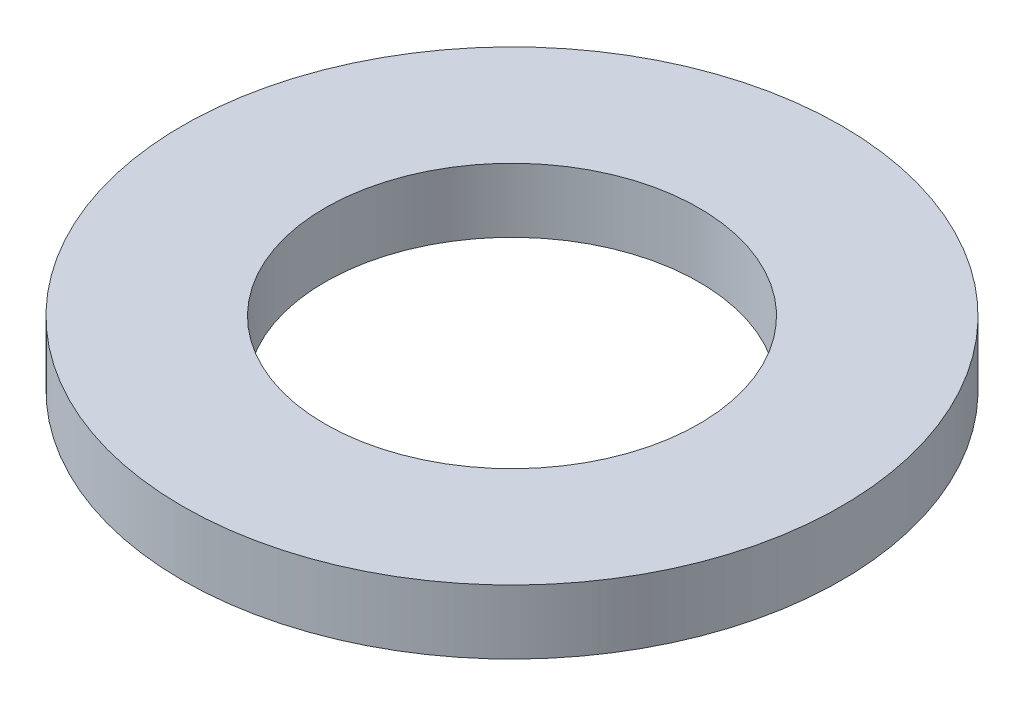
ISO-10303-21;
HEADER;
FILE_DESCRIPTION(('STEP AP214'),'2;1');
FILE_NAME('part.step','',(''),(''),'','','');
FILE_SCHEMA(('AUTOMOTIVE_DESIGN { 1 0 10303 214 1 1 1 1 }'));
ENDSEC;
DATA;
#1=APPLICATION_CONTEXT('core data for automotive mechanical design processes');
#2=APPLICATION_PROTOCOL_DEFINITION('international standard','automotive_design',2000,#1);
#3=PRODUCT_CONTEXT('',#1,'mechanical');
#4=PRODUCT('Part','Part','',(#3));
#5=PRODUCT_RELATED_PRODUCT_CATEGORY('part','',(#4));
#6=PRODUCT_DEFINITION_FORMATION('','',#4);
#7=PRODUCT_DEFINITION_CONTEXT('part definition',#1,'design');
#8=PRODUCT_DEFINITION('design','',#6,#7);
#9=PRODUCT_DEFINITION_SHAPE('','',#8);
#10=(LENGTH_UNIT() NAMED_UNIT(*) SI_UNIT(.MILLI.,.METRE.));
#11=(NAMED_UNIT(*) PLANE_ANGLE_UNIT() SI_UNIT($,.RADIAN.));
#12=(NAMED_UNIT(*) SI_UNIT($,.STERADIAN.) SOLID_ANGLE_UNIT());
#13=UNCERTAINTY_MEASURE_WITH_UNIT(LENGTH_MEASURE(1.E-05),#10,'distance_accuracy_value','');
#14=(GEOMETRIC_REPRESENTATION_CONTEXT(3) GLOBAL_UNCERTAINTY_ASSIGNED_CONTEXT((#13)) GLOBAL_UNIT_ASSIGNED_CONTEXT((#10,
#11,#12)) REPRESENTATION_CONTEXT('',''));
#15=CARTESIAN_POINT('',(0.,0.,0.));
#16=DIRECTION('',(0.,0.,1.));
#17=DIRECTION('',(1.,0.,0.));
#18=AXIS2_PLACEMENT_3D('',#15,#16,#17);
#19=CARTESIAN_POINT('',(0.,12.,0.));
#20=DIRECTION('',(0.,1.,0.));
#21=DIRECTION('',(0.,0.,1.));
#22=AXIS2_PLACEMENT_3D('',#19,#20,#21);
#23=PLANE('',#22);
#24=CARTESIAN_POINT('',(0.,12.,0.));
#25=DIRECTION('',(0.,1.,0.));
#26=DIRECTION('',(0.,0.,1.));
#27=AXIS2_PLACEMENT_3D('',#24,#25,#26);
#28=CIRCLE('',#27,61.6585153431014);
#29=CARTESIAN_POINT('',(0.,12.,61.6585153431014));
#30=VERTEX_POINT('',#29);
#31=EDGE_CURVE('E10',#30,#30,#28,.T.);
#32=ORIENTED_EDGE('',*,*,#31,.T.);
#33=EDGE_LOOP('',(#32));
#34=FACE_BOUND('',#33,.T.);
#35=CARTESIAN_POINT('',(0.,12.,0.));
#36=DIRECTION('',(0.,1.,0.));
#37=DIRECTION('',(0.,0.,1.));
#38=AXIS2_PLACEMENT_3D('',#35,#36,#37);
#39=CIRCLE('',#38,35.);
#40=CARTESIAN_POINT('',(0.,12.,35.));
#41=VERTEX_POINT('',#40);
#42=EDGE_CURVE('E42',#41,#41,#39,.T.);
#43=ORIENTED_EDGE('',*,*,#42,.F.);
#44=EDGE_LOOP('',(#43));
#45=FACE_BOUND('',#44,.T.);
#46=ADVANCED_FACE('F31',(#34,#45),#23,.T.);
#47=CARTESIAN_POINT('',(0.,0.,0.));
#48=DIRECTION('',(0.,1.,0.));
#49=DIRECTION('',(0.,0.,1.));
#50=AXIS2_PLACEMENT_3D('',#47,#48,#49);
#51=PLANE('',#50);
#52=CARTESIAN_POINT('',(0.,0.,0.));
#53=DIRECTION('',(0.,1.,0.));
#54=DIRECTION('',(0.,0.,1.));
#55=AXIS2_PLACEMENT_3D('',#52,#53,#54);
#56=CIRCLE('',#55,61.6585153431014);
#57=CARTESIAN_POINT('',(0.,0.,61.6585153431014));
#58=VERTEX_POINT('',#57);
#59=EDGE_CURVE('E35',#58,#58,#56,.T.);
#60=ORIENTED_EDGE('',*,*,#59,.F.);
#61=EDGE_LOOP('',(#60));
#62=FACE_BOUND('',#61,.T.);
#63=CARTESIAN_POINT('',(0.,0.,0.));
#64=DIRECTION('',(0.,1.,0.));
#65=DIRECTION('',(0.,0.,1.));
#66=AXIS2_PLACEMENT_3D('',#63,#64,#65);
#67=CIRCLE('',#66,35.);
#68=CARTESIAN_POINT('',(0.,0.,35.));
#69=VERTEX_POINT('',#68);
#70=EDGE_CURVE('E44',#69,#69,#67,.T.);
#71=ORIENTED_EDGE('',*,*,#70,.T.);
#72=EDGE_LOOP('',(#71));
#73=FACE_BOUND('',#72,.T.);
#74=ADVANCED_FACE('F54',(#62,#73),#51,.F.);
#75=CARTESIAN_POINT('',(0.,12.,0.));
#76=DIRECTION('',(0.,-1.,0.));
#77=DIRECTION('',(0.,0.,-1.));
#78=AXIS2_PLACEMENT_3D('',#75,#76,#77);
#79=CYLINDRICAL_SURFACE('',#78,61.6585153431014);
#80=ORIENTED_EDGE('',*,*,#31,.F.);
#81=EDGE_LOOP('',(#80));
#82=FACE_BOUND('',#81,.T.);
#83=ORIENTED_EDGE('',*,*,#59,.T.);
#84=EDGE_LOOP('',(#83));
#85=FACE_BOUND('',#84,.T.);
#86=ADVANCED_FACE('F33',(#82,#85),#79,.T.);
#87=CARTESIAN_POINT('',(0.,12.,0.));
#88=DIRECTION('',(0.,-1.,0.));
#89=DIRECTION('',(0.,0.,-1.));
#90=AXIS2_PLACEMENT_3D('',#87,#88,#89);
#91=CYLINDRICAL_SURFACE('',#90,35.);
#92=ORIENTED_EDGE('',*,*,#42,.T.);
#93=EDGE_LOOP('',(#92));
#94=FACE_BOUND('',#93,.T.);
#95=ORIENTED_EDGE('',*,*,#70,.F.);
#96=EDGE_LOOP('',(#95));
#97=FACE_BOUND('',#96,.T.);
#98=ADVANCED_FACE('F50',(#94,#97),#91,.F.);
#99=CLOSED_SHELL('',(#46,#74,#86,#98));
#100=MANIFOLD_SOLID_BREP('B2',#99);
#101=ADVANCED_BREP_SHAPE_REPRESENTATION('',(#18,#100),#14);
#102=SHAPE_DEFINITION_REPRESENTATION(#9,#101);
ENDSEC;
END-ISO-10303-21;
